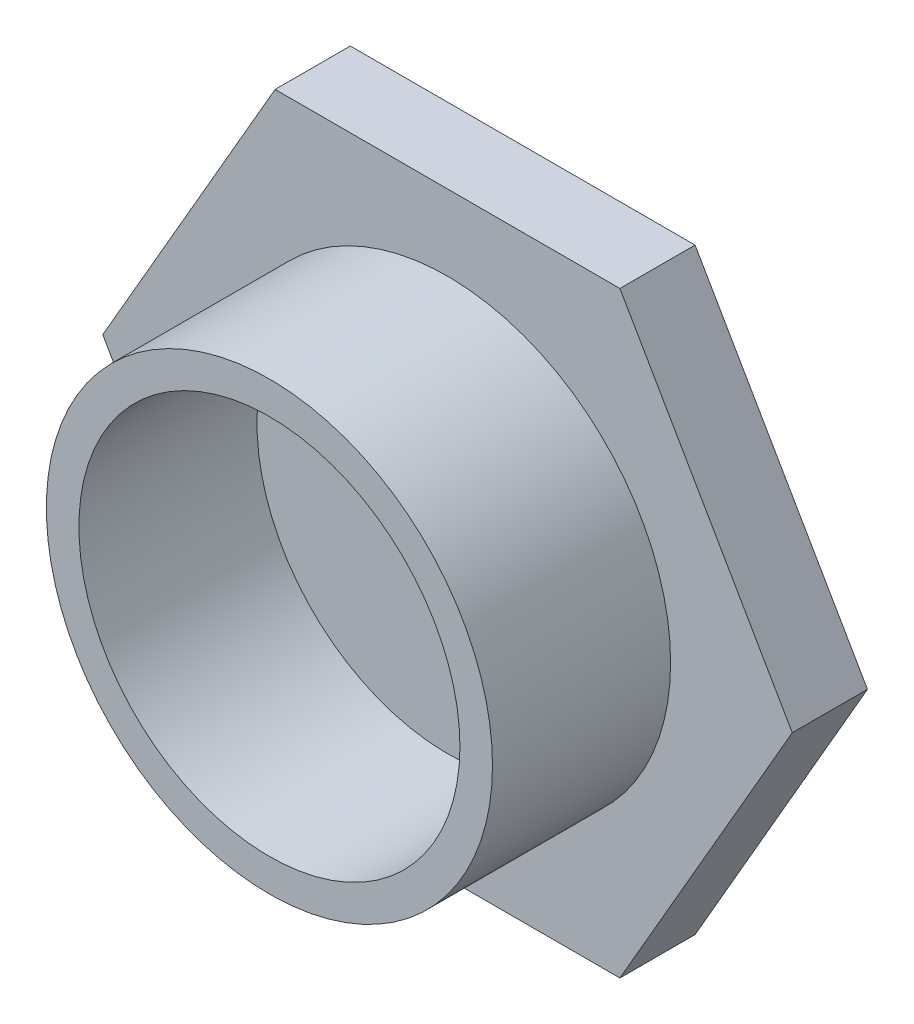
ISO-10303-21;
HEADER;
FILE_DESCRIPTION(('STEP AP214'),'2;1');
FILE_NAME('part.step','',(''),(''),'','','');
FILE_SCHEMA(('AUTOMOTIVE_DESIGN { 1 0 10303 214 1 1 1 1 }'));
ENDSEC;
DATA;
#1=APPLICATION_CONTEXT('core data for automotive mechanical design processes');
#2=APPLICATION_PROTOCOL_DEFINITION('international standard','automotive_design',2000,#1);
#3=PRODUCT_CONTEXT('',#1,'mechanical');
#4=PRODUCT('Part','Part','',(#3));
#5=PRODUCT_RELATED_PRODUCT_CATEGORY('part','',(#4));
#6=PRODUCT_DEFINITION_FORMATION('','',#4);
#7=PRODUCT_DEFINITION_CONTEXT('part definition',#1,'design');
#8=PRODUCT_DEFINITION('design','',#6,#7);
#9=PRODUCT_DEFINITION_SHAPE('','',#8);
#10=(LENGTH_UNIT() NAMED_UNIT(*) SI_UNIT(.MILLI.,.METRE.));
#11=(NAMED_UNIT(*) PLANE_ANGLE_UNIT() SI_UNIT($,.RADIAN.));
#12=(NAMED_UNIT(*) SI_UNIT($,.STERADIAN.) SOLID_ANGLE_UNIT());
#13=UNCERTAINTY_MEASURE_WITH_UNIT(LENGTH_MEASURE(1.E-05),#10,'distance_accuracy_value','');
#14=(GEOMETRIC_REPRESENTATION_CONTEXT(3) GLOBAL_UNCERTAINTY_ASSIGNED_CONTEXT((#13)) GLOBAL_UNIT_ASSIGNED_CONTEXT((#10,
#11,#12)) REPRESENTATION_CONTEXT('',''));
#15=CARTESIAN_POINT('',(0.,0.,0.));
#16=DIRECTION('',(0.,0.,1.));
#17=DIRECTION('',(1.,0.,0.));
#18=AXIS2_PLACEMENT_3D('',#15,#16,#17);
#19=CARTESIAN_POINT('',(12.464992311804,21.59,5.4356));
#20=DIRECTION('',(0.,-1.,0.));
#21=DIRECTION('',(1.,0.,0.));
#22=AXIS2_PLACEMENT_3D('',#19,#20,#21);
#23=PLANE('',#22);
#24=DIRECTION('',(-1.,0.,0.));
#25=VECTOR('',#24,1.);
#26=CARTESIAN_POINT('',(12.464992311804,21.59,0.));
#27=LINE('',#26,#25);
#28=CARTESIAN_POINT('',(12.464992311804,21.59,0.));
#29=VERTEX_POINT('',#28);
#30=CARTESIAN_POINT('',(-12.464992311804,21.59,0.));
#31=VERTEX_POINT('',#30);
#32=EDGE_CURVE('E141',#29,#31,#27,.T.);
#33=ORIENTED_EDGE('',*,*,#32,.T.);
#34=DIRECTION('',(0.,0.,-1.));
#35=VECTOR('',#34,1.);
#36=CARTESIAN_POINT('',(-12.464992311804,21.59,5.4356));
#37=LINE('',#36,#35);
#38=CARTESIAN_POINT('',(-12.464992311804,21.59,5.4356));
#39=VERTEX_POINT('',#38);
#40=EDGE_CURVE('E60',#39,#31,#37,.T.);
#41=ORIENTED_EDGE('',*,*,#40,.F.);
#42=DIRECTION('',(-1.,0.,0.));
#43=VECTOR('',#42,1.);
#44=CARTESIAN_POINT('',(12.464992311804,21.59,5.4356));
#45=LINE('',#44,#43);
#46=CARTESIAN_POINT('',(12.464992311804,21.59,5.4356));
#47=VERTEX_POINT('',#46);
#48=EDGE_CURVE('E158',#47,#39,#45,.T.);
#49=ORIENTED_EDGE('',*,*,#48,.F.);
#50=DIRECTION('',(0.,0.,-1.));
#51=VECTOR('',#50,1.);
#52=CARTESIAN_POINT('',(12.464992311804,21.59,5.4356));
#53=LINE('',#52,#51);
#54=EDGE_CURVE('E137',#47,#29,#53,.T.);
#55=ORIENTED_EDGE('',*,*,#54,.T.);
#56=EDGE_LOOP('',(#33,#41,#49,#55));
#57=FACE_BOUND('',#56,.T.);
#58=ADVANCED_FACE('F51',(#57),#23,.F.);
#59=CARTESIAN_POINT('',(-12.464992311804,21.59,5.4356));
#60=DIRECTION('',(0.866025403784439,-0.5,0.));
#61=DIRECTION('',(0.5,0.866025403784439,0.));
#62=AXIS2_PLACEMENT_3D('',#59,#60,#61);
#63=PLANE('',#62);
#64=DIRECTION('',(-0.5,-0.866025403784439,0.));
#65=VECTOR('',#64,1.);
#66=CARTESIAN_POINT('',(-12.464992311804,21.59,0.));
#67=LINE('',#66,#65);
#68=CARTESIAN_POINT('',(-24.929984623608,0.,0.));
#69=VERTEX_POINT('',#68);
#70=EDGE_CURVE('E145',#31,#69,#67,.T.);
#71=ORIENTED_EDGE('',*,*,#70,.T.);
#72=DIRECTION('',(0.,0.,-1.));
#73=VECTOR('',#72,1.);
#74=CARTESIAN_POINT('',(-24.929984623608,0.,5.4356));
#75=LINE('',#74,#73);
#76=CARTESIAN_POINT('',(-24.929984623608,0.,5.4356));
#77=VERTEX_POINT('',#76);
#78=EDGE_CURVE('E165',#77,#69,#75,.T.);
#79=ORIENTED_EDGE('',*,*,#78,.F.);
#80=DIRECTION('',(-0.5,-0.866025403784439,0.));
#81=VECTOR('',#80,1.);
#82=CARTESIAN_POINT('',(-12.464992311804,21.59,5.4356));
#83=LINE('',#82,#81);
#84=EDGE_CURVE('E106',#39,#77,#83,.T.);
#85=ORIENTED_EDGE('',*,*,#84,.F.);
#86=ORIENTED_EDGE('',*,*,#40,.T.);
#87=EDGE_LOOP('',(#71,#79,#85,#86));
#88=FACE_BOUND('',#87,.T.);
#89=ADVANCED_FACE('F170',(#88),#63,.F.);
#90=CARTESIAN_POINT('',(-24.929984623608,0.,5.4356));
#91=DIRECTION('',(0.866025403784439,0.5,0.));
#92=DIRECTION('',(-0.5,0.866025403784439,0.));
#93=AXIS2_PLACEMENT_3D('',#90,#91,#92);
#94=PLANE('',#93);
#95=DIRECTION('',(0.5,-0.866025403784438,0.));
#96=VECTOR('',#95,1.);
#97=CARTESIAN_POINT('',(-24.929984623608,0.,0.));
#98=LINE('',#97,#96);
#99=CARTESIAN_POINT('',(-12.464992311804,-21.59,0.));
#100=VERTEX_POINT('',#99);
#101=EDGE_CURVE('E149',#69,#100,#98,.T.);
#102=ORIENTED_EDGE('',*,*,#101,.T.);
#103=DIRECTION('',(0.,0.,-1.));
#104=VECTOR('',#103,1.);
#105=CARTESIAN_POINT('',(-12.464992311804,-21.59,5.4356));
#106=LINE('',#105,#104);
#107=CARTESIAN_POINT('',(-12.464992311804,-21.59,5.4356));
#108=VERTEX_POINT('',#107);
#109=EDGE_CURVE('E130',#108,#100,#106,.T.);
#110=ORIENTED_EDGE('',*,*,#109,.F.);
#111=DIRECTION('',(0.5,-0.866025403784438,0.));
#112=VECTOR('',#111,1.);
#113=CARTESIAN_POINT('',(-24.929984623608,0.,5.4356));
#114=LINE('',#113,#112);
#115=EDGE_CURVE('E119',#77,#108,#114,.T.);
#116=ORIENTED_EDGE('',*,*,#115,.F.);
#117=ORIENTED_EDGE('',*,*,#78,.T.);
#118=EDGE_LOOP('',(#102,#110,#116,#117));
#119=FACE_BOUND('',#118,.T.);
#120=ADVANCED_FACE('F178',(#119),#94,.F.);
#121=CARTESIAN_POINT('',(-12.464992311804,-21.59,5.4356));
#122=DIRECTION('',(0.,1.,0.));
#123=DIRECTION('',(-1.,0.,0.));
#124=AXIS2_PLACEMENT_3D('',#121,#122,#123);
#125=PLANE('',#124);
#126=DIRECTION('',(1.,0.,0.));
#127=VECTOR('',#126,1.);
#128=CARTESIAN_POINT('',(-12.464992311804,-21.59,0.));
#129=LINE('',#128,#127);
#130=CARTESIAN_POINT('',(12.464992311804,-21.59,0.));
#131=VERTEX_POINT('',#130);
#132=EDGE_CURVE('E128',#100,#131,#129,.T.);
#133=ORIENTED_EDGE('',*,*,#132,.T.);
#134=DIRECTION('',(0.,0.,-1.));
#135=VECTOR('',#134,1.);
#136=CARTESIAN_POINT('',(12.464992311804,-21.59,5.4356));
#137=LINE('',#136,#135);
#138=CARTESIAN_POINT('',(12.464992311804,-21.59,5.4356));
#139=VERTEX_POINT('',#138);
#140=EDGE_CURVE('E125',#139,#131,#137,.T.);
#141=ORIENTED_EDGE('',*,*,#140,.F.);
#142=DIRECTION('',(1.,0.,0.));
#143=VECTOR('',#142,1.);
#144=CARTESIAN_POINT('',(-12.464992311804,-21.59,5.4356));
#145=LINE('',#144,#143);
#146=EDGE_CURVE('E113',#108,#139,#145,.T.);
#147=ORIENTED_EDGE('',*,*,#146,.F.);
#148=ORIENTED_EDGE('',*,*,#109,.T.);
#149=EDGE_LOOP('',(#133,#141,#147,#148));
#150=FACE_BOUND('',#149,.T.);
#151=ADVANCED_FACE('F126',(#150),#125,.F.);
#152=CARTESIAN_POINT('',(12.464992311804,-21.59,5.4356));
#153=DIRECTION('',(-0.866025403784439,0.5,0.));
#154=DIRECTION('',(-0.5,-0.866025403784439,0.));
#155=AXIS2_PLACEMENT_3D('',#152,#153,#154);
#156=PLANE('',#155);
#157=DIRECTION('',(0.5,0.866025403784439,0.));
#158=VECTOR('',#157,1.);
#159=CARTESIAN_POINT('',(12.464992311804,-21.59,0.));
#160=LINE('',#159,#158);
#161=CARTESIAN_POINT('',(24.929984623608,0.,0.));
#162=VERTEX_POINT('',#161);
#163=EDGE_CURVE('E91',#131,#162,#160,.T.);
#164=ORIENTED_EDGE('',*,*,#163,.T.);
#165=DIRECTION('',(0.,0.,-1.));
#166=VECTOR('',#165,1.);
#167=CARTESIAN_POINT('',(24.929984623608,0.,5.4356));
#168=LINE('',#167,#166);
#169=CARTESIAN_POINT('',(24.929984623608,0.,5.4356));
#170=VERTEX_POINT('',#169);
#171=EDGE_CURVE('E131',#170,#162,#168,.T.);
#172=ORIENTED_EDGE('',*,*,#171,.F.);
#173=DIRECTION('',(0.5,0.866025403784439,0.));
#174=VECTOR('',#173,1.);
#175=CARTESIAN_POINT('',(12.464992311804,-21.59,5.4356));
#176=LINE('',#175,#174);
#177=EDGE_CURVE('E117',#139,#170,#176,.T.);
#178=ORIENTED_EDGE('',*,*,#177,.F.);
#179=ORIENTED_EDGE('',*,*,#140,.T.);
#180=EDGE_LOOP('',(#164,#172,#178,#179));
#181=FACE_BOUND('',#180,.T.);
#182=ADVANCED_FACE('F133',(#181),#156,.F.);
#183=CARTESIAN_POINT('',(24.929984623608,0.,5.4356));
#184=DIRECTION('',(-0.866025403784439,-0.5,0.));
#185=DIRECTION('',(0.5,-0.866025403784439,0.));
#186=AXIS2_PLACEMENT_3D('',#183,#184,#185);
#187=PLANE('',#186);
#188=DIRECTION('',(-0.5,0.866025403784439,0.));
#189=VECTOR('',#188,1.);
#190=CARTESIAN_POINT('',(24.929984623608,0.,0.));
#191=LINE('',#190,#189);
#192=EDGE_CURVE('E97',#162,#29,#191,.T.);
#193=ORIENTED_EDGE('',*,*,#192,.T.);
#194=ORIENTED_EDGE('',*,*,#54,.F.);
#195=DIRECTION('',(-0.5,0.866025403784439,0.));
#196=VECTOR('',#195,1.);
#197=CARTESIAN_POINT('',(24.929984623608,0.,5.4356));
#198=LINE('',#197,#196);
#199=EDGE_CURVE('E68',#170,#47,#198,.T.);
#200=ORIENTED_EDGE('',*,*,#199,.F.);
#201=ORIENTED_EDGE('',*,*,#171,.T.);
#202=EDGE_LOOP('',(#193,#194,#200,#201));
#203=FACE_BOUND('',#202,.T.);
#204=ADVANCED_FACE('F227',(#203),#187,.F.);
#205=CARTESIAN_POINT('',(0.,0.,5.4356));
#206=DIRECTION('',(0.,0.,1.));
#207=DIRECTION('',(1.,0.,0.));
#208=AXIS2_PLACEMENT_3D('',#205,#206,#207);
#209=PLANE('',#208);
#210=CARTESIAN_POINT('',(0.,0.,5.4356));
#211=DIRECTION('',(0.,0.,1.));
#212=DIRECTION('',(1.,0.,0.));
#213=AXIS2_PLACEMENT_3D('',#210,#211,#212);
#214=CIRCLE('',#213,16.1299163615552);
#215=CARTESIAN_POINT('',(16.1299163615552,0.,5.4356));
#216=VERTEX_POINT('',#215);
#217=EDGE_CURVE('E185',#216,#216,#214,.T.);
#218=ORIENTED_EDGE('',*,*,#217,.F.);
#219=EDGE_LOOP('',(#218));
#220=FACE_BOUND('',#219,.T.);
#221=ORIENTED_EDGE('',*,*,#48,.T.);
#222=ORIENTED_EDGE('',*,*,#84,.T.);
#223=ORIENTED_EDGE('',*,*,#115,.T.);
#224=ORIENTED_EDGE('',*,*,#146,.T.);
#225=ORIENTED_EDGE('',*,*,#177,.T.);
#226=ORIENTED_EDGE('',*,*,#199,.T.);
#227=EDGE_LOOP('',(#221,#222,#223,#224,#225,#226));
#228=FACE_BOUND('',#227,.T.);
#229=ADVANCED_FACE('F115',(#220,#228),#209,.T.);
#230=CARTESIAN_POINT('',(0.,0.,0.));
#231=DIRECTION('',(0.,0.,1.));
#232=DIRECTION('',(1.,0.,0.));
#233=AXIS2_PLACEMENT_3D('',#230,#231,#232);
#234=PLANE('',#233);
#235=ORIENTED_EDGE('',*,*,#32,.F.);
#236=ORIENTED_EDGE('',*,*,#192,.F.);
#237=ORIENTED_EDGE('',*,*,#163,.F.);
#238=ORIENTED_EDGE('',*,*,#132,.F.);
#239=ORIENTED_EDGE('',*,*,#101,.F.);
#240=ORIENTED_EDGE('',*,*,#70,.F.);
#241=EDGE_LOOP('',(#235,#236,#237,#238,#239,#240));
#242=FACE_BOUND('',#241,.T.);
#243=ADVANCED_FACE('F175',(#242),#234,.F.);
#244=CARTESIAN_POINT('',(0.,0.,18.3134));
#245=DIRECTION('',(0.,0.,1.));
#246=DIRECTION('',(1.,0.,0.));
#247=AXIS2_PLACEMENT_3D('',#244,#245,#246);
#248=PLANE('',#247);
#249=CARTESIAN_POINT('',(0.,0.,18.3134));
#250=DIRECTION('',(0.,0.,1.));
#251=DIRECTION('',(1.,0.,0.));
#252=AXIS2_PLACEMENT_3D('',#249,#250,#251);
#253=CIRCLE('',#252,16.1299163615552);
#254=CARTESIAN_POINT('',(16.1299163615552,0.,18.3134));
#255=VERTEX_POINT('',#254);
#256=EDGE_CURVE('E146',#255,#255,#253,.T.);
#257=ORIENTED_EDGE('',*,*,#256,.T.);
#258=EDGE_LOOP('',(#257));
#259=FACE_BOUND('',#258,.T.);
#260=CARTESIAN_POINT('',(0.,0.,18.3134));
#261=DIRECTION('',(0.,0.,1.));
#262=DIRECTION('',(1.,0.,0.));
#263=AXIS2_PLACEMENT_3D('',#260,#261,#262);
#264=CIRCLE('',#263,13.7760674482801);
#265=CARTESIAN_POINT('',(13.7760674482801,0.,18.3134));
#266=VERTEX_POINT('',#265);
#267=EDGE_CURVE('E189',#266,#266,#264,.T.);
#268=ORIENTED_EDGE('',*,*,#267,.F.);
#269=EDGE_LOOP('',(#268));
#270=FACE_BOUND('',#269,.T.);
#271=ADVANCED_FACE('F200',(#259,#270),#248,.T.);
#272=CARTESIAN_POINT('',(0.,0.,18.3134));
#273=DIRECTION('',(0.,0.,-1.));
#274=DIRECTION('',(-1.,0.,0.));
#275=AXIS2_PLACEMENT_3D('',#272,#273,#274);
#276=CYLINDRICAL_SURFACE('',#275,16.1299163615552);
#277=ORIENTED_EDGE('',*,*,#256,.F.);
#278=EDGE_LOOP('',(#277));
#279=FACE_BOUND('',#278,.T.);
#280=ORIENTED_EDGE('',*,*,#217,.T.);
#281=EDGE_LOOP('',(#280));
#282=FACE_BOUND('',#281,.T.);
#283=ADVANCED_FACE('F202',(#279,#282),#276,.T.);
#284=CARTESIAN_POINT('',(0.,0.,18.3134));
#285=DIRECTION('',(0.,0.,-1.));
#286=DIRECTION('',(-1.,0.,0.));
#287=AXIS2_PLACEMENT_3D('',#284,#285,#286);
#288=CYLINDRICAL_SURFACE('',#287,13.7760674482801);
#289=ORIENTED_EDGE('',*,*,#267,.T.);
#290=EDGE_LOOP('',(#289));
#291=FACE_BOUND('',#290,.T.);
#292=CARTESIAN_POINT('',(0.,0.,5.4356));
#293=DIRECTION('',(0.,0.,1.));
#294=DIRECTION('',(1.,0.,0.));
#295=AXIS2_PLACEMENT_3D('',#292,#293,#294);
#296=CIRCLE('',#295,13.7760674482801);
#297=CARTESIAN_POINT('',(13.7760674482801,0.,5.4356));
#298=VERTEX_POINT('',#297);
#299=EDGE_CURVE('E12',#298,#298,#296,.F.);
#300=ORIENTED_EDGE('',*,*,#299,.T.);
#301=EDGE_LOOP('',(#300));
#302=FACE_BOUND('',#301,.T.);
#303=ADVANCED_FACE('F197',(#291,#302),#288,.F.);
#304=ORIENTED_EDGE('',*,*,#299,.F.);
#305=EDGE_LOOP('',(#304));
#306=FACE_BOUND('',#305,.T.);
#307=ADVANCED_FACE('F231',(#306),#209,.T.);
#308=CLOSED_SHELL('',(#58,#89,#120,#151,#182,#204,#229,#243,#271,#283,#303,#307));
#309=MANIFOLD_SOLID_BREP('B2',#308);
#310=ADVANCED_BREP_SHAPE_REPRESENTATION('',(#18,#309),#14);
#311=SHAPE_DEFINITION_REPRESENTATION(#9,#310);
ENDSEC;
END-ISO-10303-21;
